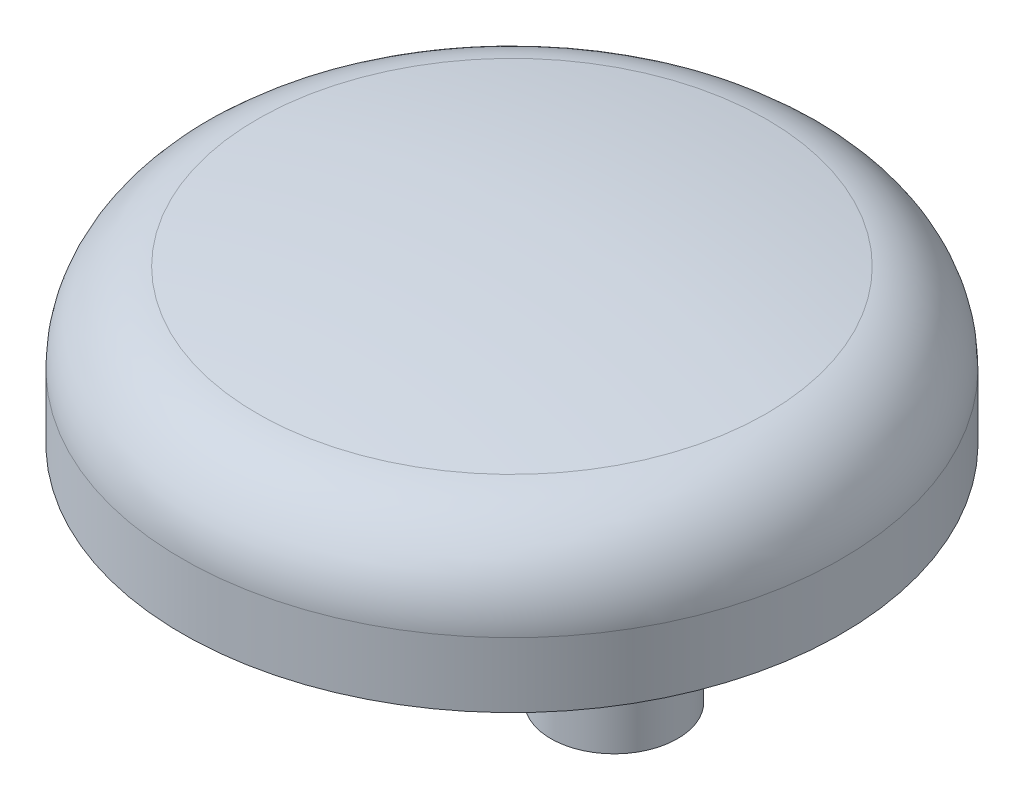
ISO-10303-21;
HEADER;
FILE_DESCRIPTION(('STEP AP214'),'2;1');
FILE_NAME('part.step','',(''),(''),'','','');
FILE_SCHEMA(('AUTOMOTIVE_DESIGN { 1 0 10303 214 1 1 1 1 }'));
ENDSEC;
DATA;
#1=APPLICATION_CONTEXT('core data for automotive mechanical design processes');
#2=APPLICATION_PROTOCOL_DEFINITION('international standard','automotive_design',2000,#1);
#3=PRODUCT_CONTEXT('',#1,'mechanical');
#4=PRODUCT('Part','Part','',(#3));
#5=PRODUCT_RELATED_PRODUCT_CATEGORY('part','',(#4));
#6=PRODUCT_DEFINITION_FORMATION('','',#4);
#7=PRODUCT_DEFINITION_CONTEXT('part definition',#1,'design');
#8=PRODUCT_DEFINITION('design','',#6,#7);
#9=PRODUCT_DEFINITION_SHAPE('','',#8);
#10=(LENGTH_UNIT() NAMED_UNIT(*) SI_UNIT(.MILLI.,.METRE.));
#11=(NAMED_UNIT(*) PLANE_ANGLE_UNIT() SI_UNIT($,.RADIAN.));
#12=(NAMED_UNIT(*) SI_UNIT($,.STERADIAN.) SOLID_ANGLE_UNIT());
#13=UNCERTAINTY_MEASURE_WITH_UNIT(LENGTH_MEASURE(1.E-05),#10,'distance_accuracy_value','');
#14=(GEOMETRIC_REPRESENTATION_CONTEXT(3) GLOBAL_UNCERTAINTY_ASSIGNED_CONTEXT((#13)) GLOBAL_UNIT_ASSIGNED_CONTEXT((#10,
#11,#12)) REPRESENTATION_CONTEXT('',''));
#15=CARTESIAN_POINT('',(0.,0.,0.));
#16=DIRECTION('',(0.,0.,1.));
#17=DIRECTION('',(1.,0.,0.));
#18=AXIS2_PLACEMENT_3D('',#15,#16,#17);
#19=CARTESIAN_POINT('',(0.,0.,0.));
#20=DIRECTION('',(0.,-1.,0.));
#21=DIRECTION('',(0.,0.,-1.));
#22=AXIS2_PLACEMENT_3D('',#19,#20,#21);
#23=PLANE('',#22);
#24=CARTESIAN_POINT('',(0.,0.,0.));
#25=DIRECTION('',(0.,-1.,0.));
#26=DIRECTION('',(0.,0.,-1.));
#27=AXIS2_PLACEMENT_3D('',#24,#25,#26);
#28=CIRCLE('',#27,33.02);
#29=CARTESIAN_POINT('',(0.,0.,-33.02));
#30=VERTEX_POINT('',#29);
#31=EDGE_CURVE('E10',#30,#30,#28,.T.);
#32=ORIENTED_EDGE('',*,*,#31,.T.);
#33=EDGE_LOOP('',(#32));
#34=FACE_BOUND('',#33,.T.);
#35=CARTESIAN_POINT('',(6.477,0.,-3.77));
#36=DIRECTION('',(0.,-1.,0.));
#37=DIRECTION('',(0.,0.,-1.));
#38=AXIS2_PLACEMENT_3D('',#35,#36,#37);
#39=CIRCLE('',#38,6.35);
#40=CARTESIAN_POINT('',(6.477,0.,-10.12));
#41=VERTEX_POINT('',#40);
#42=EDGE_CURVE('E48',#41,#41,#39,.T.);
#43=ORIENTED_EDGE('',*,*,#42,.F.);
#44=EDGE_LOOP('',(#43));
#45=FACE_BOUND('',#44,.T.);
#46=ADVANCED_FACE('F31',(#34,#45),#23,.T.);
#47=CARTESIAN_POINT('',(0.,-21.5757658967363,0.));
#48=DIRECTION('',(0.,-1.,0.));
#49=DIRECTION('',(0.,0.,-1.));
#50=AXIS2_PLACEMENT_3D('',#47,#48,#49);
#51=CYLINDRICAL_SURFACE('',#50,33.02);
#52=CARTESIAN_POINT('',(0.,6.49997073011707,0.));
#53=DIRECTION('',(0.,-1.,0.));
#54=DIRECTION('',(0.,0.,-1.));
#55=AXIS2_PLACEMENT_3D('',#52,#53,#54);
#56=CIRCLE('',#55,33.02);
#57=CARTESIAN_POINT('',(0.,6.49997073011707,-33.02));
#58=VERTEX_POINT('',#57);
#59=EDGE_CURVE('E37',#58,#58,#56,.T.);
#60=ORIENTED_EDGE('',*,*,#59,.T.);
#61=EDGE_LOOP('',(#60));
#62=FACE_BOUND('',#61,.T.);
#63=ORIENTED_EDGE('',*,*,#31,.F.);
#64=EDGE_LOOP('',(#63));
#65=FACE_BOUND('',#64,.T.);
#66=ADVANCED_FACE('F64',(#62,#65),#51,.T.);
#67=CARTESIAN_POINT('',(0.,6.49997073011707,0.));
#68=DIRECTION('',(0.,-1.,0.));
#69=DIRECTION('',(0.,0.,-1.));
#70=AXIS2_PLACEMENT_3D('',#67,#68,#69);
#71=TOROIDAL_SURFACE('',#70,24.02,8.99999999999998);
#72=CARTESIAN_POINT('',(0.,15.3728140813796,0.));
#73=DIRECTION('',(0.,-1.,0.));
#74=DIRECTION('',(0.,0.,-1.));
#75=AXIS2_PLACEMENT_3D('',#72,#73,#74);
#76=CIRCLE('',#75,25.5275313807531);
#77=CARTESIAN_POINT('',(0.,15.3728140813796,-25.5275313807531));
#78=VERTEX_POINT('',#77);
#79=EDGE_CURVE('E41',#78,#78,#76,.T.);
#80=ORIENTED_EDGE('',*,*,#79,.T.);
#81=EDGE_LOOP('',(#80));
#82=FACE_BOUND('',#81,.T.);
#83=ORIENTED_EDGE('',*,*,#59,.F.);
#84=EDGE_LOOP('',(#83));
#85=FACE_BOUND('',#84,.T.);
#86=ADVANCED_FACE('F70',(#82,#85),#71,.T.);
#87=CARTESIAN_POINT('',(0.,-134.874,0.));
#88=DIRECTION('',(0.,-1.,0.));
#89=DIRECTION('',(1.,0.,0.));
#90=AXIS2_PLACEMENT_3D('',#87,#88,#89);
#91=SPHERICAL_SURFACE('',#90,152.4);
#92=ORIENTED_EDGE('',*,*,#79,.F.);
#93=EDGE_LOOP('',(#92));
#94=FACE_BOUND('',#93,.T.);
#95=ADVANCED_FACE('F59',(#94),#91,.T.);
#96=CARTESIAN_POINT('',(6.477,-21.082,-3.77));
#97=DIRECTION('',(0.,1.,0.));
#98=DIRECTION('',(0.,0.,1.));
#99=AXIS2_PLACEMENT_3D('',#96,#97,#98);
#100=CYLINDRICAL_SURFACE('',#99,6.35);
#101=CARTESIAN_POINT('',(6.477,-21.082,-3.77));
#102=DIRECTION('',(0.,-1.,0.));
#103=DIRECTION('',(0.,0.,-1.));
#104=AXIS2_PLACEMENT_3D('',#101,#102,#103);
#105=CIRCLE('',#104,6.35);
#106=CARTESIAN_POINT('',(6.477,-21.082,-10.12));
#107=VERTEX_POINT('',#106);
#108=EDGE_CURVE('E45',#107,#107,#105,.T.);
#109=ORIENTED_EDGE('',*,*,#108,.F.);
#110=EDGE_LOOP('',(#109));
#111=FACE_BOUND('',#110,.T.);
#112=ORIENTED_EDGE('',*,*,#42,.T.);
#113=EDGE_LOOP('',(#112));
#114=FACE_BOUND('',#113,.T.);
#115=ADVANCED_FACE('F56',(#111,#114),#100,.T.);
#116=CARTESIAN_POINT('',(6.477,-21.082,-3.77));
#117=DIRECTION('',(0.,-1.,0.));
#118=DIRECTION('',(0.,0.,-1.));
#119=AXIS2_PLACEMENT_3D('',#116,#117,#118);
#120=PLANE('',#119);
#121=ORIENTED_EDGE('',*,*,#108,.T.);
#122=EDGE_LOOP('',(#121));
#123=FACE_BOUND('',#122,.T.);
#124=ADVANCED_FACE('F54',(#123),#120,.T.);
#125=CLOSED_SHELL('',(#46,#66,#86,#95,#115,#124));
#126=MANIFOLD_SOLID_BREP('B2',#125);
#127=ADVANCED_BREP_SHAPE_REPRESENTATION('',(#18,#126),#14);
#128=SHAPE_DEFINITION_REPRESENTATION(#9,#127);
ENDSEC;
END-ISO-10303-21;
